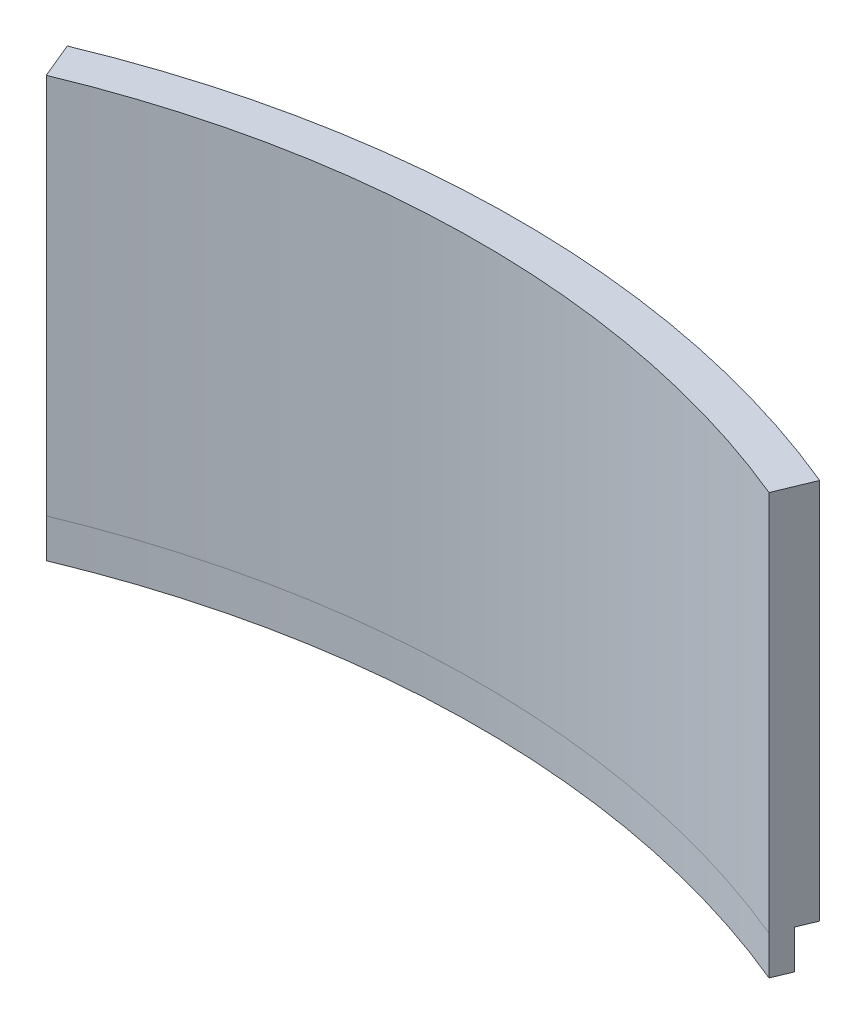
ISO-10303-21;
HEADER;
FILE_DESCRIPTION(('STEP AP214'),'2;1');
FILE_NAME('part.step','',(''),(''),'','','');
FILE_SCHEMA(('AUTOMOTIVE_DESIGN { 1 0 10303 214 1 1 1 1 }'));
ENDSEC;
DATA;
#1=APPLICATION_CONTEXT('core data for automotive mechanical design processes');
#2=APPLICATION_PROTOCOL_DEFINITION('international standard','automotive_design',2000,#1);
#3=PRODUCT_CONTEXT('',#1,'mechanical');
#4=PRODUCT('Part','Part','',(#3));
#5=PRODUCT_RELATED_PRODUCT_CATEGORY('part','',(#4));
#6=PRODUCT_DEFINITION_FORMATION('','',#4);
#7=PRODUCT_DEFINITION_CONTEXT('part definition',#1,'design');
#8=PRODUCT_DEFINITION('design','',#6,#7);
#9=PRODUCT_DEFINITION_SHAPE('','',#8);
#10=(LENGTH_UNIT() NAMED_UNIT(*) SI_UNIT(.MILLI.,.METRE.));
#11=(NAMED_UNIT(*) PLANE_ANGLE_UNIT() SI_UNIT($,.RADIAN.));
#12=(NAMED_UNIT(*) SI_UNIT($,.STERADIAN.) SOLID_ANGLE_UNIT());
#13=UNCERTAINTY_MEASURE_WITH_UNIT(LENGTH_MEASURE(1.E-05),#10,'distance_accuracy_value','');
#14=(GEOMETRIC_REPRESENTATION_CONTEXT(3) GLOBAL_UNCERTAINTY_ASSIGNED_CONTEXT((#13)) GLOBAL_UNIT_ASSIGNED_CONTEXT((#10,
#11,#12)) REPRESENTATION_CONTEXT('',''));
#15=CARTESIAN_POINT('',(0.,0.,0.));
#16=DIRECTION('',(0.,0.,1.));
#17=DIRECTION('',(1.,0.,0.));
#18=AXIS2_PLACEMENT_3D('',#15,#16,#17);
#19=CARTESIAN_POINT('',(0.,-3.,0.));
#20=DIRECTION('',(0.,-1.,0.));
#21=DIRECTION('',(0.,0.,-1.));
#22=AXIS2_PLACEMENT_3D('',#19,#20,#21);
#23=PLANE('',#22);
#24=CARTESIAN_POINT('',(0.,-3.,-0.25239814640007));
#25=DIRECTION('',(0.,1.,0.));
#26=DIRECTION('',(0.,0.,-1.));
#27=AXIS2_PLACEMENT_3D('',#24,#25,#26);
#28=CIRCLE('',#27,72.7668786229346);
#29=CARTESIAN_POINT('',(27.9358905626516,-3.,-67.4432058733239));
#30=VERTEX_POINT('',#29);
#31=CARTESIAN_POINT('',(-27.9358905626516,-3.,-67.4432058733239));
#32=VERTEX_POINT('',#31);
#33=EDGE_CURVE('E116',#30,#32,#28,.T.);
#34=ORIENTED_EDGE('',*,*,#33,.F.);
#35=CARTESIAN_POINT('',(0.,-3.,0.));
#36=DIRECTION('',(0.,1.,0.));
#37=DIRECTION('',(0.,0.,-1.));
#38=AXIS2_PLACEMENT_3D('',#35,#36,#37);
#39=CIRCLE('',#38,73.);
#40=EDGE_CURVE('E127',#30,#32,#39,.T.);
#41=ORIENTED_EDGE('',*,*,#40,.T.);
#42=EDGE_LOOP('',(#34,#41));
#43=FACE_BOUND('',#42,.T.);
#44=ADVANCED_FACE('F33',(#43),#23,.T.);
#45=CARTESIAN_POINT('',(0.,26.5,0.));
#46=DIRECTION('',(0.,-1.,0.));
#47=DIRECTION('',(0.,0.,-1.));
#48=AXIS2_PLACEMENT_3D('',#45,#46,#47);
#49=CYLINDRICAL_SURFACE('',#48,76.);
#50=DIRECTION('',(0.,-1.,0.));
#51=VECTOR('',#50,1.);
#52=CARTESIAN_POINT('',(29.0839408597469,26.5,-70.2148444708578));
#53=LINE('',#52,#51);
#54=CARTESIAN_POINT('',(29.0839408597469,26.5,-70.2148444708578));
#55=VERTEX_POINT('',#54);
#56=CARTESIAN_POINT('',(29.0839408597469,-3.,-70.2148444708578));
#57=VERTEX_POINT('',#56);
#58=EDGE_CURVE('E139',#55,#57,#53,.T.);
#59=ORIENTED_EDGE('',*,*,#58,.T.);
#60=CARTESIAN_POINT('',(0.,-3.,0.));
#61=DIRECTION('',(0.,-1.,0.));
#62=DIRECTION('',(0.,0.,-1.));
#63=AXIS2_PLACEMENT_3D('',#60,#61,#62);
#64=CIRCLE('',#63,76.);
#65=CARTESIAN_POINT('',(-29.0839408597469,-3.,-70.2148444708578));
#66=VERTEX_POINT('',#65);
#67=EDGE_CURVE('E117',#66,#57,#64,.T.);
#68=ORIENTED_EDGE('',*,*,#67,.F.);
#69=DIRECTION('',(0.,-1.,0.));
#70=VECTOR('',#69,1.);
#71=CARTESIAN_POINT('',(-29.0839408597469,26.5,-70.2148444708578));
#72=LINE('',#71,#70);
#73=CARTESIAN_POINT('',(-29.0839408597469,26.5,-70.2148444708578));
#74=VERTEX_POINT('',#73);
#75=EDGE_CURVE('E11',#74,#66,#72,.T.);
#76=ORIENTED_EDGE('',*,*,#75,.F.);
#77=CARTESIAN_POINT('',(0.,26.5,0.));
#78=DIRECTION('',(0.,1.,0.));
#79=DIRECTION('',(0.,0.,-1.));
#80=AXIS2_PLACEMENT_3D('',#77,#78,#79);
#81=CIRCLE('',#80,76.);
#82=EDGE_CURVE('E132',#55,#74,#81,.T.);
#83=ORIENTED_EDGE('',*,*,#82,.F.);
#84=EDGE_LOOP('',(#59,#68,#76,#83));
#85=FACE_BOUND('',#84,.T.);
#86=ADVANCED_FACE('F35',(#85),#49,.T.);
#87=CARTESIAN_POINT('',(-29.0839408597469,26.5,-70.2148444708578));
#88=DIRECTION('',(0.923879532511286,0.,-0.382683432365092));
#89=DIRECTION('',(-0.382683432365092,0.,-0.923879532511286));
#90=AXIS2_PLACEMENT_3D('',#87,#88,#89);
#91=PLANE('',#90);
#92=ORIENTED_EDGE('',*,*,#75,.T.);
#93=DIRECTION('',(-0.382683432365092,0.,-0.923879532511286));
#94=VECTOR('',#93,1.);
#95=CARTESIAN_POINT('',(-29.0839408597469,-3.,-70.2148444708578));
#96=LINE('',#95,#94);
#97=CARTESIAN_POINT('',(-28.5099157111993,-3.,-68.8290251720908));
#98=VERTEX_POINT('',#97);
#99=EDGE_CURVE('E130',#98,#66,#96,.T.);
#100=ORIENTED_EDGE('',*,*,#99,.F.);
#101=DIRECTION('',(0.,1.,0.));
#102=VECTOR('',#101,1.);
#103=CARTESIAN_POINT('',(-28.5099157111993,-6.,-68.8290251720908));
#104=LINE('',#103,#102);
#105=CARTESIAN_POINT('',(-28.5099157111993,-6.,-68.8290251720908));
#106=VERTEX_POINT('',#105);
#107=EDGE_CURVE('E101',#106,#98,#104,.T.);
#108=ORIENTED_EDGE('',*,*,#107,.F.);
#109=DIRECTION('',(-0.382683432365092,0.,-0.923879532511286));
#110=VECTOR('',#109,1.);
#111=CARTESIAN_POINT('',(-27.9358905626516,-6.,-67.4432058733239));
#112=LINE('',#111,#110);
#113=CARTESIAN_POINT('',(-27.9358905626516,-6.,-67.4432058733239));
#114=VERTEX_POINT('',#113);
#115=EDGE_CURVE('E93',#114,#106,#112,.T.);
#116=ORIENTED_EDGE('',*,*,#115,.F.);
#117=DIRECTION('',(0.,1.,0.));
#118=VECTOR('',#117,1.);
#119=CARTESIAN_POINT('',(-27.9358905626516,-6.,-67.4432058733239));
#120=LINE('',#119,#118);
#121=EDGE_CURVE('E98',#114,#32,#120,.T.);
#122=ORIENTED_EDGE('',*,*,#121,.T.);
#123=DIRECTION('',(0.,-1.,0.));
#124=VECTOR('',#123,1.);
#125=CARTESIAN_POINT('',(-27.9358905626516,26.5,-67.4432058733239));
#126=LINE('',#125,#124);
#127=CARTESIAN_POINT('',(-27.9358905626516,26.5,-67.4432058733239));
#128=VERTEX_POINT('',#127);
#129=EDGE_CURVE('E41',#128,#32,#126,.T.);
#130=ORIENTED_EDGE('',*,*,#129,.F.);
#131=DIRECTION('',(0.382683432365092,0.,0.923879532511286));
#132=VECTOR('',#131,1.);
#133=CARTESIAN_POINT('',(-29.0839408597469,26.5,-70.2148444708578));
#134=LINE('',#133,#132);
#135=EDGE_CURVE('E134',#74,#128,#134,.T.);
#136=ORIENTED_EDGE('',*,*,#135,.F.);
#137=EDGE_LOOP('',(#92,#100,#108,#116,#122,#130,#136));
#138=FACE_BOUND('',#137,.T.);
#139=ADVANCED_FACE('F95',(#138),#91,.F.);
#140=CARTESIAN_POINT('',(0.,26.5,0.));
#141=DIRECTION('',(0.,-1.,0.));
#142=DIRECTION('',(0.,0.,-1.));
#143=AXIS2_PLACEMENT_3D('',#140,#141,#142);
#144=CYLINDRICAL_SURFACE('',#143,73.);
#145=ORIENTED_EDGE('',*,*,#129,.T.);
#146=ORIENTED_EDGE('',*,*,#40,.F.);
#147=DIRECTION('',(0.,-1.,0.));
#148=VECTOR('',#147,1.);
#149=CARTESIAN_POINT('',(27.9358905626516,26.5,-67.4432058733239));
#150=LINE('',#149,#148);
#151=CARTESIAN_POINT('',(27.9358905626516,26.5,-67.4432058733239));
#152=VERTEX_POINT('',#151);
#153=EDGE_CURVE('E141',#152,#30,#150,.T.);
#154=ORIENTED_EDGE('',*,*,#153,.F.);
#155=CARTESIAN_POINT('',(0.,26.5,0.));
#156=DIRECTION('',(0.,-1.,0.));
#157=DIRECTION('',(0.,0.,-1.));
#158=AXIS2_PLACEMENT_3D('',#155,#156,#157);
#159=CIRCLE('',#158,73.);
#160=EDGE_CURVE('E136',#128,#152,#159,.T.);
#161=ORIENTED_EDGE('',*,*,#160,.F.);
#162=EDGE_LOOP('',(#145,#146,#154,#161));
#163=FACE_BOUND('',#162,.T.);
#164=ADVANCED_FACE('F146',(#163),#144,.F.);
#165=CARTESIAN_POINT('',(29.0839408597469,26.5,-70.2148444708578));
#166=DIRECTION('',(-0.923879532511287,0.,-0.382683432365088));
#167=DIRECTION('',(-0.382683432365088,0.,0.923879532511288));
#168=AXIS2_PLACEMENT_3D('',#165,#166,#167);
#169=PLANE('',#168);
#170=ORIENTED_EDGE('',*,*,#153,.T.);
#171=DIRECTION('',(0.,1.,0.));
#172=VECTOR('',#171,1.);
#173=CARTESIAN_POINT('',(27.9358905626516,-6.,-67.4432058733239));
#174=LINE('',#173,#172);
#175=CARTESIAN_POINT('',(27.9358905626516,-6.,-67.4432058733239));
#176=VERTEX_POINT('',#175);
#177=EDGE_CURVE('E152',#176,#30,#174,.T.);
#178=ORIENTED_EDGE('',*,*,#177,.F.);
#179=DIRECTION('',(-0.382683432365084,0.,0.923879532511289));
#180=VECTOR('',#179,1.);
#181=CARTESIAN_POINT('',(27.9358905626516,-6.,-67.4432058733239));
#182=LINE('',#181,#180);
#183=CARTESIAN_POINT('',(28.5099157111993,-6.,-68.8290251720908));
#184=VERTEX_POINT('',#183);
#185=EDGE_CURVE('E110',#184,#176,#182,.T.);
#186=ORIENTED_EDGE('',*,*,#185,.F.);
#187=DIRECTION('',(0.,1.,0.));
#188=VECTOR('',#187,1.);
#189=CARTESIAN_POINT('',(28.5099157111993,-6.,-68.8290251720908));
#190=LINE('',#189,#188);
#191=CARTESIAN_POINT('',(28.5099157111993,-3.,-68.8290251720908));
#192=VERTEX_POINT('',#191);
#193=EDGE_CURVE('E122',#184,#192,#190,.T.);
#194=ORIENTED_EDGE('',*,*,#193,.T.);
#195=DIRECTION('',(-0.382683432365082,0.,0.92387953251129));
#196=VECTOR('',#195,1.);
#197=CARTESIAN_POINT('',(27.9358905626516,-3.,-67.4432058733239));
#198=LINE('',#197,#196);
#199=EDGE_CURVE('E120',#57,#192,#198,.T.);
#200=ORIENTED_EDGE('',*,*,#199,.F.);
#201=ORIENTED_EDGE('',*,*,#58,.F.);
#202=DIRECTION('',(0.382683432365088,0.,-0.923879532511288));
#203=VECTOR('',#202,1.);
#204=CARTESIAN_POINT('',(29.0839408597469,26.5,-70.2148444708578));
#205=LINE('',#204,#203);
#206=EDGE_CURVE('E56',#152,#55,#205,.T.);
#207=ORIENTED_EDGE('',*,*,#206,.F.);
#208=EDGE_LOOP('',(#170,#178,#186,#194,#200,#201,#207));
#209=FACE_BOUND('',#208,.T.);
#210=ADVANCED_FACE('F151',(#209),#169,.F.);
#211=CARTESIAN_POINT('',(0.,26.5,0.));
#212=DIRECTION('',(0.,-1.,0.));
#213=DIRECTION('',(0.,0.,-1.));
#214=AXIS2_PLACEMENT_3D('',#211,#212,#213);
#215=PLANE('',#214);
#216=ORIENTED_EDGE('',*,*,#82,.T.);
#217=ORIENTED_EDGE('',*,*,#135,.T.);
#218=ORIENTED_EDGE('',*,*,#160,.T.);
#219=ORIENTED_EDGE('',*,*,#206,.T.);
#220=EDGE_LOOP('',(#216,#217,#218,#219));
#221=FACE_BOUND('',#220,.T.);
#222=ADVANCED_FACE('F159',(#221),#215,.F.);
#223=CARTESIAN_POINT('',(0.,-3.,-0.25239814640007));
#224=DIRECTION('',(0.,-1.,0.));
#225=DIRECTION('',(0.,0.,1.));
#226=AXIS2_PLACEMENT_3D('',#223,#224,#225);
#227=CIRCLE('',#226,74.2668773281898);
#228=EDGE_CURVE('E48',#98,#192,#227,.T.);
#229=ORIENTED_EDGE('',*,*,#228,.F.);
#230=ORIENTED_EDGE('',*,*,#99,.T.);
#231=ORIENTED_EDGE('',*,*,#67,.T.);
#232=ORIENTED_EDGE('',*,*,#199,.T.);
#233=EDGE_LOOP('',(#229,#230,#231,#232));
#234=FACE_BOUND('',#233,.T.);
#235=ADVANCED_FACE('F160',(#234),#23,.T.);
#236=CARTESIAN_POINT('',(0.,-6.,-0.25239814640007));
#237=DIRECTION('',(0.,1.,0.));
#238=DIRECTION('',(0.,0.,1.));
#239=AXIS2_PLACEMENT_3D('',#236,#237,#238);
#240=CYLINDRICAL_SURFACE('',#239,72.7668786229346);
#241=ORIENTED_EDGE('',*,*,#33,.T.);
#242=ORIENTED_EDGE('',*,*,#121,.F.);
#243=CARTESIAN_POINT('',(0.,-6.,-0.25239814640007));
#244=DIRECTION('',(0.,1.,0.));
#245=DIRECTION('',(0.,0.,-1.));
#246=AXIS2_PLACEMENT_3D('',#243,#244,#245);
#247=CIRCLE('',#246,72.7668786229346);
#248=EDGE_CURVE('E105',#176,#114,#247,.T.);
#249=ORIENTED_EDGE('',*,*,#248,.F.);
#250=ORIENTED_EDGE('',*,*,#177,.T.);
#251=EDGE_LOOP('',(#241,#242,#249,#250));
#252=FACE_BOUND('',#251,.T.);
#253=ADVANCED_FACE('F115',(#252),#240,.F.);
#254=CARTESIAN_POINT('',(0.,-6.,-0.25239814640007));
#255=DIRECTION('',(0.,1.,0.));
#256=DIRECTION('',(0.,0.,1.));
#257=AXIS2_PLACEMENT_3D('',#254,#255,#256);
#258=CYLINDRICAL_SURFACE('',#257,74.2668773281898);
#259=ORIENTED_EDGE('',*,*,#228,.T.);
#260=ORIENTED_EDGE('',*,*,#193,.F.);
#261=CARTESIAN_POINT('',(0.,-6.,-0.25239814640007));
#262=DIRECTION('',(0.,-1.,0.));
#263=DIRECTION('',(0.,0.,1.));
#264=AXIS2_PLACEMENT_3D('',#261,#262,#263);
#265=CIRCLE('',#264,74.2668773281898);
#266=EDGE_CURVE('E104',#106,#184,#265,.T.);
#267=ORIENTED_EDGE('',*,*,#266,.F.);
#268=ORIENTED_EDGE('',*,*,#107,.T.);
#269=EDGE_LOOP('',(#259,#260,#267,#268));
#270=FACE_BOUND('',#269,.T.);
#271=ADVANCED_FACE('F163',(#270),#258,.T.);
#272=CARTESIAN_POINT('',(0.,-6.,-0.25239814640007));
#273=DIRECTION('',(0.,-1.,0.));
#274=DIRECTION('',(0.,0.,-1.));
#275=AXIS2_PLACEMENT_3D('',#272,#273,#274);
#276=PLANE('',#275);
#277=ORIENTED_EDGE('',*,*,#248,.T.);
#278=ORIENTED_EDGE('',*,*,#115,.T.);
#279=ORIENTED_EDGE('',*,*,#266,.T.);
#280=ORIENTED_EDGE('',*,*,#185,.T.);
#281=EDGE_LOOP('',(#277,#278,#279,#280));
#282=FACE_BOUND('',#281,.T.);
#283=ADVANCED_FACE('F108',(#282),#276,.T.);
#284=CLOSED_SHELL('',(#44,#86,#139,#164,#210,#222,#235,#253,#271,#283));
#285=MANIFOLD_SOLID_BREP('B2',#284);
#286=ADVANCED_BREP_SHAPE_REPRESENTATION('',(#18,#285),#14);
#287=SHAPE_DEFINITION_REPRESENTATION(#9,#286);
ENDSEC;
END-ISO-10303-21;
